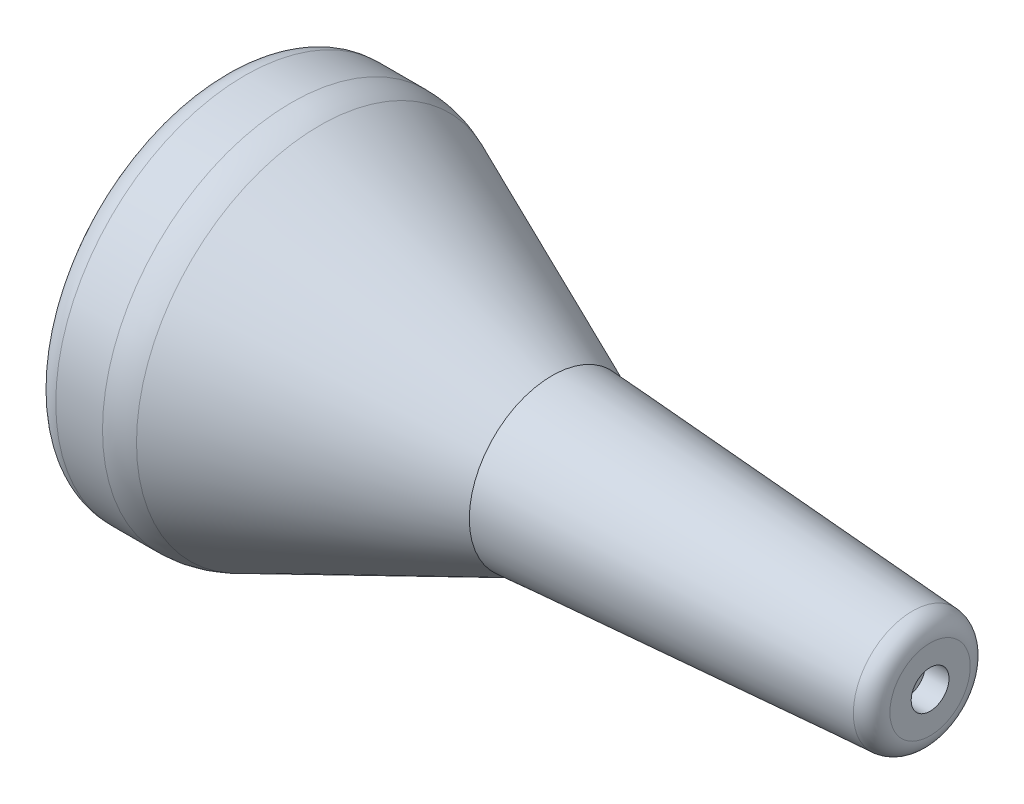
ISO-10303-21;
HEADER;
FILE_DESCRIPTION(('STEP AP214'),'2;1');
FILE_NAME('part.step','',(''),(''),'','','');
FILE_SCHEMA(('AUTOMOTIVE_DESIGN { 1 0 10303 214 1 1 1 1 }'));
ENDSEC;
DATA;
#1=APPLICATION_CONTEXT('core data for automotive mechanical design processes');
#2=APPLICATION_PROTOCOL_DEFINITION('international standard','automotive_design',2000,#1);
#3=PRODUCT_CONTEXT('',#1,'mechanical');
#4=PRODUCT('Part','Part','',(#3));
#5=PRODUCT_RELATED_PRODUCT_CATEGORY('part','',(#4));
#6=PRODUCT_DEFINITION_FORMATION('','',#4);
#7=PRODUCT_DEFINITION_CONTEXT('part definition',#1,'design');
#8=PRODUCT_DEFINITION('design','',#6,#7);
#9=PRODUCT_DEFINITION_SHAPE('','',#8);
#10=(LENGTH_UNIT() NAMED_UNIT(*) SI_UNIT(.MILLI.,.METRE.));
#11=(NAMED_UNIT(*) PLANE_ANGLE_UNIT() SI_UNIT($,.RADIAN.));
#12=(NAMED_UNIT(*) SI_UNIT($,.STERADIAN.) SOLID_ANGLE_UNIT());
#13=UNCERTAINTY_MEASURE_WITH_UNIT(LENGTH_MEASURE(1.E-05),#10,'distance_accuracy_value','');
#14=(GEOMETRIC_REPRESENTATION_CONTEXT(3) GLOBAL_UNCERTAINTY_ASSIGNED_CONTEXT((#13)) GLOBAL_UNIT_ASSIGNED_CONTEXT((#10,
#11,#12)) REPRESENTATION_CONTEXT('',''));
#15=CARTESIAN_POINT('',(0.,0.,0.));
#16=DIRECTION('',(0.,0.,1.));
#17=DIRECTION('',(1.,0.,0.));
#18=AXIS2_PLACEMENT_3D('',#15,#16,#17);
#19=CARTESIAN_POINT('',(0.,0.,0.));
#20=DIRECTION('',(1.,0.,0.));
#21=DIRECTION('',(0.,0.,-1.));
#22=AXIS2_PLACEMENT_3D('',#19,#20,#21);
#23=PLANE('',#22);
#24=CARTESIAN_POINT('',(0.,0.,0.));
#25=DIRECTION('',(-1.,0.,0.));
#26=DIRECTION('',(0.,0.,1.));
#27=AXIS2_PLACEMENT_3D('',#24,#25,#26);
#28=CIRCLE('',#27,7.);
#29=CARTESIAN_POINT('',(0.,0.,7.));
#30=VERTEX_POINT('',#29);
#31=EDGE_CURVE('E10',#30,#30,#28,.T.);
#32=ORIENTED_EDGE('',*,*,#31,.T.);
#33=EDGE_LOOP('',(#32));
#34=FACE_BOUND('',#33,.T.);
#35=CARTESIAN_POINT('',(0.,0.,0.));
#36=DIRECTION('',(1.,0.,0.));
#37=DIRECTION('',(0.,0.,-1.));
#38=AXIS2_PLACEMENT_3D('',#35,#36,#37);
#39=CIRCLE('',#38,5.67715441484552);
#40=CARTESIAN_POINT('',(0.,0.,-5.67715441484552));
#41=VERTEX_POINT('',#40);
#42=EDGE_CURVE('E34',#41,#41,#39,.F.);
#43=ORIENTED_EDGE('',*,*,#42,.F.);
#44=EDGE_LOOP('',(#43));
#45=FACE_BOUND('',#44,.T.);
#46=ADVANCED_FACE('F31',(#34,#45),#23,.F.);
#47=CARTESIAN_POINT('',(1.,0.,0.));
#48=DIRECTION('',(-1.,0.,0.));
#49=DIRECTION('',(0.,0.,1.));
#50=AXIS2_PLACEMENT_3D('',#47,#48,#49);
#51=TOROIDAL_SURFACE('',#50,7.,1.);
#52=ORIENTED_EDGE('',*,*,#31,.F.);
#53=EDGE_LOOP('',(#52));
#54=FACE_BOUND('',#53,.T.);
#55=CARTESIAN_POINT('',(1.,0.,0.));
#56=DIRECTION('',(-1.,0.,0.));
#57=DIRECTION('',(0.,0.,1.));
#58=AXIS2_PLACEMENT_3D('',#55,#56,#57);
#59=CIRCLE('',#58,8.);
#60=CARTESIAN_POINT('',(1.,0.,8.));
#61=VERTEX_POINT('',#60);
#62=EDGE_CURVE('E38',#61,#61,#59,.T.);
#63=ORIENTED_EDGE('',*,*,#62,.T.);
#64=EDGE_LOOP('',(#63));
#65=FACE_BOUND('',#64,.T.);
#66=ADVANCED_FACE('F72',(#54,#65),#51,.T.);
#67=CARTESIAN_POINT('',(30.,0.,0.));
#68=DIRECTION('',(-1.,0.,0.));
#69=DIRECTION('',(0.,0.,1.));
#70=AXIS2_PLACEMENT_3D('',#67,#68,#69);
#71=CYLINDRICAL_SURFACE('',#70,8.);
#72=ORIENTED_EDGE('',*,*,#62,.F.);
#73=EDGE_LOOP('',(#72));
#74=FACE_BOUND('',#73,.T.);
#75=CARTESIAN_POINT('',(2.9787909176002,0.,0.));
#76=DIRECTION('',(-1.,0.,0.));
#77=DIRECTION('',(0.,0.,1.));
#78=AXIS2_PLACEMENT_3D('',#75,#76,#77);
#79=CIRCLE('',#78,8.);
#80=CARTESIAN_POINT('',(2.9787909176002,0.,8.));
#81=VERTEX_POINT('',#80);
#82=EDGE_CURVE('E42',#81,#81,#79,.T.);
#83=ORIENTED_EDGE('',*,*,#82,.T.);
#84=EDGE_LOOP('',(#83));
#85=FACE_BOUND('',#84,.T.);
#86=ADVANCED_FACE('F76',(#74,#85),#71,.T.);
#87=CARTESIAN_POINT('',(2.97879091760017,0.,0.));
#88=DIRECTION('',(-1.,0.,0.));
#89=DIRECTION('',(0.,0.,1.));
#90=AXIS2_PLACEMENT_3D('',#87,#88,#89);
#91=TOROIDAL_SURFACE('',#90,4.99999999999987,3.00000000000013);
#92=ORIENTED_EDGE('',*,*,#82,.F.);
#93=EDGE_LOOP('',(#92));
#94=FACE_BOUND('',#93,.T.);
#95=CARTESIAN_POINT('',(4.17012713688682,0.,0.));
#96=DIRECTION('',(-1.,0.,0.));
#97=DIRECTION('',(0.,0.,1.));
#98=AXIS2_PLACEMENT_3D('',#95,#96,#97);
#99=CIRCLE('',#98,7.75331037346243);
#100=CARTESIAN_POINT('',(4.17012713688682,0.,7.75331037346243));
#101=VERTEX_POINT('',#100);
#102=EDGE_CURVE('E47',#101,#101,#99,.T.);
#103=ORIENTED_EDGE('',*,*,#102,.T.);
#104=EDGE_LOOP('',(#103));
#105=FACE_BOUND('',#104,.T.);
#106=ADVANCED_FACE('F81',(#94,#105),#91,.T.);
#107=CARTESIAN_POINT('',(14.,0.,0.));
#108=DIRECTION('',(-1.,0.,0.));
#109=DIRECTION('',(0.,0.,1.));
#110=AXIS2_PLACEMENT_3D('',#107,#108,#109);
#111=CONICAL_SURFACE('',#110,3.5,0.408368017937232);
#112=ORIENTED_EDGE('',*,*,#102,.F.);
#113=EDGE_LOOP('',(#112));
#114=FACE_BOUND('',#113,.T.);
#115=CARTESIAN_POINT('',(14.,0.,0.));
#116=DIRECTION('',(-1.,0.,0.));
#117=DIRECTION('',(0.,0.,1.));
#118=AXIS2_PLACEMENT_3D('',#115,#116,#117);
#119=CIRCLE('',#118,3.5);
#120=CARTESIAN_POINT('',(14.,0.,3.5));
#121=VERTEX_POINT('',#120);
#122=EDGE_CURVE('E50',#121,#121,#119,.T.);
#123=ORIENTED_EDGE('',*,*,#122,.T.);
#124=EDGE_LOOP('',(#123));
#125=FACE_BOUND('',#124,.T.);
#126=ADVANCED_FACE('F88',(#114,#125),#111,.T.);
#127=CARTESIAN_POINT('',(29.2523873145251,0.,0.));
#128=DIRECTION('',(-1.,0.,0.));
#129=DIRECTION('',(0.,0.,1.));
#130=AXIS2_PLACEMENT_3D('',#127,#128,#129);
#131=CONICAL_SURFACE('',#130,2.49906208248429,0.0655310349213802);
#132=ORIENTED_EDGE('',*,*,#122,.F.);
#133=EDGE_LOOP('',(#132));
#134=FACE_BOUND('',#133,.T.);
#135=CARTESIAN_POINT('',(29.2523873145251,0.,0.));
#136=DIRECTION('',(-1.,0.,0.));
#137=DIRECTION('',(0.,0.,1.));
#138=AXIS2_PLACEMENT_3D('',#135,#136,#137);
#139=CIRCLE('',#138,2.49906208248429);
#140=CARTESIAN_POINT('',(29.2523873145251,0.,2.49906208248429));
#141=VERTEX_POINT('',#140);
#142=EDGE_CURVE('E53',#141,#141,#139,.T.);
#143=ORIENTED_EDGE('',*,*,#142,.T.);
#144=EDGE_LOOP('',(#143));
#145=FACE_BOUND('',#144,.T.);
#146=ADVANCED_FACE('F92',(#134,#145),#131,.T.);
#147=CARTESIAN_POINT('',(29.2,0.,0.));
#148=DIRECTION('',(-1.,0.,0.));
#149=DIRECTION('',(0.,0.,1.));
#150=AXIS2_PLACEMENT_3D('',#147,#148,#149);
#151=TOROIDAL_SURFACE('',#150,1.70077919448227,0.799999999999997);
#152=ORIENTED_EDGE('',*,*,#142,.F.);
#153=EDGE_LOOP('',(#152));
#154=FACE_BOUND('',#153,.T.);
#155=CARTESIAN_POINT('',(30.,0.,0.));
#156=DIRECTION('',(-1.,0.,0.));
#157=DIRECTION('',(0.,0.,1.));
#158=AXIS2_PLACEMENT_3D('',#155,#156,#157);
#159=CIRCLE('',#158,1.70077919448227);
#160=CARTESIAN_POINT('',(30.,0.,1.70077919448227));
#161=VERTEX_POINT('',#160);
#162=EDGE_CURVE('E56',#161,#161,#159,.T.);
#163=ORIENTED_EDGE('',*,*,#162,.T.);
#164=EDGE_LOOP('',(#163));
#165=FACE_BOUND('',#164,.T.);
#166=ADVANCED_FACE('F96',(#154,#165),#151,.T.);
#167=CARTESIAN_POINT('',(30.,1.70077919448227,0.));
#168=DIRECTION('',(-1.,0.,0.));
#169=DIRECTION('',(0.,0.,1.));
#170=AXIS2_PLACEMENT_3D('',#167,#168,#169);
#171=PLANE('',#170);
#172=ORIENTED_EDGE('',*,*,#162,.F.);
#173=EDGE_LOOP('',(#172));
#174=FACE_BOUND('',#173,.T.);
#175=CARTESIAN_POINT('',(30.,0.,0.));
#176=DIRECTION('',(-1.,0.,0.));
#177=DIRECTION('',(0.,0.,1.));
#178=AXIS2_PLACEMENT_3D('',#175,#176,#177);
#179=CIRCLE('',#178,0.8);
#180=CARTESIAN_POINT('',(30.,0.,0.8));
#181=VERTEX_POINT('',#180);
#182=EDGE_CURVE('E59',#181,#181,#179,.T.);
#183=ORIENTED_EDGE('',*,*,#182,.T.);
#184=EDGE_LOOP('',(#183));
#185=FACE_BOUND('',#184,.T.);
#186=ADVANCED_FACE('F100',(#174,#185),#171,.F.);
#187=CARTESIAN_POINT('',(30.,0.,0.));
#188=DIRECTION('',(-1.,0.,0.));
#189=DIRECTION('',(0.,0.,1.));
#190=AXIS2_PLACEMENT_3D('',#187,#188,#189);
#191=CYLINDRICAL_SURFACE('',#190,0.8);
#192=ORIENTED_EDGE('',*,*,#182,.F.);
#193=EDGE_LOOP('',(#192));
#194=FACE_BOUND('',#193,.T.);
#195=CARTESIAN_POINT('',(29.,0.,0.));
#196=DIRECTION('',(-1.,0.,0.));
#197=DIRECTION('',(0.,0.,1.));
#198=AXIS2_PLACEMENT_3D('',#195,#196,#197);
#199=CIRCLE('',#198,0.8);
#200=CARTESIAN_POINT('',(29.,0.,0.8));
#201=VERTEX_POINT('',#200);
#202=EDGE_CURVE('E62',#201,#201,#199,.T.);
#203=ORIENTED_EDGE('',*,*,#202,.T.);
#204=EDGE_LOOP('',(#203));
#205=FACE_BOUND('',#204,.T.);
#206=ADVANCED_FACE('F104',(#194,#205),#191,.F.);
#207=CARTESIAN_POINT('',(29.,0.8,0.));
#208=DIRECTION('',(-1.,0.,0.));
#209=DIRECTION('',(0.,0.,1.));
#210=AXIS2_PLACEMENT_3D('',#207,#208,#209);
#211=PLANE('',#210);
#212=ORIENTED_EDGE('',*,*,#202,.F.);
#213=EDGE_LOOP('',(#212));
#214=FACE_BOUND('',#213,.T.);
#215=ADVANCED_FACE('F108',(#214),#211,.F.);
#216=CARTESIAN_POINT('',(2.7,0.,0.));
#217=DIRECTION('',(-1.,0.,0.));
#218=DIRECTION('',(0.,1.,0.));
#219=AXIS2_PLACEMENT_3D('',#216,#217,#218);
#220=SPHERICAL_SURFACE('',#219,6.2865);
#221=ORIENTED_EDGE('',*,*,#42,.T.);
#222=EDGE_LOOP('',(#221));
#223=FACE_BOUND('',#222,.T.);
#224=ADVANCED_FACE('F69',(#223),#220,.F.);
#225=CLOSED_SHELL('',(#46,#66,#86,#106,#126,#146,#166,#186,#206,#215,#224));
#226=MANIFOLD_SOLID_BREP('B2',#225);
#227=ADVANCED_BREP_SHAPE_REPRESENTATION('',(#18,#226),#14);
#228=SHAPE_DEFINITION_REPRESENTATION(#9,#227);
ENDSEC;
END-ISO-10303-21;
